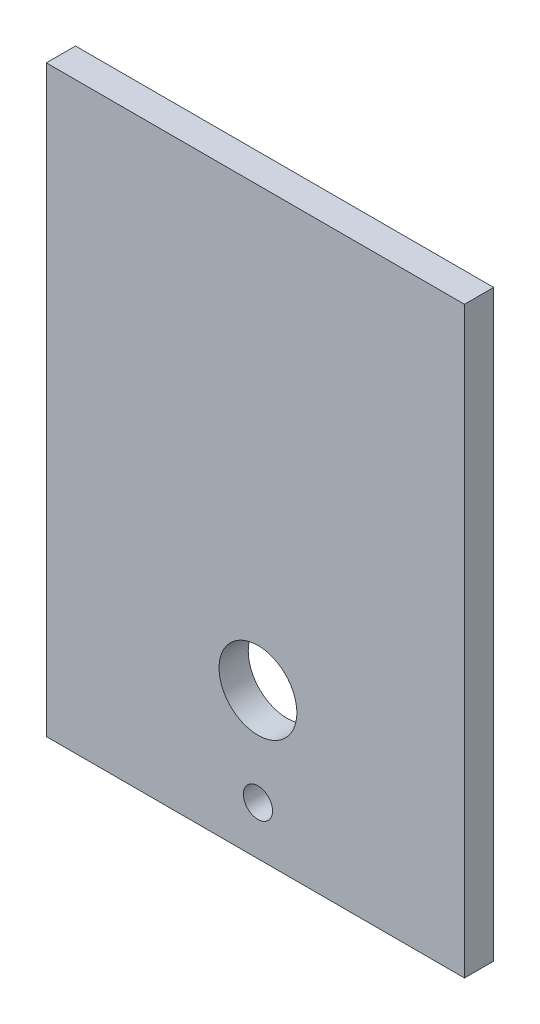
ISO-10303-21;
HEADER;
FILE_DESCRIPTION(('STEP AP214'),'2;1');
FILE_NAME('part.step','',(''),(''),'','','');
FILE_SCHEMA(('AUTOMOTIVE_DESIGN { 1 0 10303 214 1 1 1 1 }'));
ENDSEC;
DATA;
#1=APPLICATION_CONTEXT('core data for automotive mechanical design processes');
#2=APPLICATION_PROTOCOL_DEFINITION('international standard','automotive_design',2000,#1);
#3=PRODUCT_CONTEXT('',#1,'mechanical');
#4=PRODUCT('Part','Part','',(#3));
#5=PRODUCT_RELATED_PRODUCT_CATEGORY('part','',(#4));
#6=PRODUCT_DEFINITION_FORMATION('','',#4);
#7=PRODUCT_DEFINITION_CONTEXT('part definition',#1,'design');
#8=PRODUCT_DEFINITION('design','',#6,#7);
#9=PRODUCT_DEFINITION_SHAPE('','',#8);
#10=(LENGTH_UNIT() NAMED_UNIT(*) SI_UNIT(.MILLI.,.METRE.));
#11=(NAMED_UNIT(*) PLANE_ANGLE_UNIT() SI_UNIT($,.RADIAN.));
#12=(NAMED_UNIT(*) SI_UNIT($,.STERADIAN.) SOLID_ANGLE_UNIT());
#13=UNCERTAINTY_MEASURE_WITH_UNIT(LENGTH_MEASURE(1.E-05),#10,'distance_accuracy_value','');
#14=(GEOMETRIC_REPRESENTATION_CONTEXT(3) GLOBAL_UNCERTAINTY_ASSIGNED_CONTEXT((#13)) GLOBAL_UNIT_ASSIGNED_CONTEXT((#10,
#11,#12)) REPRESENTATION_CONTEXT('',''));
#15=CARTESIAN_POINT('',(0.,0.,0.));
#16=DIRECTION('',(0.,0.,1.));
#17=DIRECTION('',(1.,0.,0.));
#18=AXIS2_PLACEMENT_3D('',#15,#16,#17);
#19=CARTESIAN_POINT('',(0.,0.,76.2));
#20=DIRECTION('',(0.,0.,-1.));
#21=DIRECTION('',(-1.,0.,0.));
#22=AXIS2_PLACEMENT_3D('',#19,#20,#21);
#23=PLANE('',#22);
#24=DIRECTION('',(0.,-1.,0.));
#25=VECTOR('',#24,1.);
#26=CARTESIAN_POINT('',(0.,0.,76.2));
#27=LINE('',#26,#25);
#28=CARTESIAN_POINT('',(0.,1524.,76.2));
#29=VERTEX_POINT('',#28);
#30=CARTESIAN_POINT('',(0.,0.,76.2));
#31=VERTEX_POINT('',#30);
#32=EDGE_CURVE('E88',#29,#31,#27,.T.);
#33=ORIENTED_EDGE('',*,*,#32,.T.);
#34=DIRECTION('',(1.,0.,0.));
#35=VECTOR('',#34,1.);
#36=CARTESIAN_POINT('',(0.,0.,76.2));
#37=LINE('',#36,#35);
#38=CARTESIAN_POINT('',(1092.2,0.,76.2));
#39=VERTEX_POINT('',#38);
#40=EDGE_CURVE('E83',#31,#39,#37,.T.);
#41=ORIENTED_EDGE('',*,*,#40,.T.);
#42=DIRECTION('',(0.,1.,0.));
#43=VECTOR('',#42,1.);
#44=CARTESIAN_POINT('',(1092.2,0.,76.2));
#45=LINE('',#44,#43);
#46=CARTESIAN_POINT('',(1092.2,1524.,76.2));
#47=VERTEX_POINT('',#46);
#48=EDGE_CURVE('E86',#39,#47,#45,.T.);
#49=ORIENTED_EDGE('',*,*,#48,.T.);
#50=DIRECTION('',(-1.,0.,0.));
#51=VECTOR('',#50,1.);
#52=CARTESIAN_POINT('',(0.,1524.,76.2));
#53=LINE('',#52,#51);
#54=EDGE_CURVE('E53',#47,#29,#53,.T.);
#55=ORIENTED_EDGE('',*,*,#54,.T.);
#56=EDGE_LOOP('',(#33,#41,#49,#55));
#57=FACE_BOUND('',#56,.T.);
#58=CARTESIAN_POINT('',(552.718036359124,381.,76.2));
#59=DIRECTION('',(0.,0.,1.));
#60=DIRECTION('',(1.,0.,0.));
#61=AXIS2_PLACEMENT_3D('',#58,#59,#60);
#62=CIRCLE('',#61,101.6);
#63=CARTESIAN_POINT('',(451.118036359124,381.,76.2));
#64=VERTEX_POINT('',#63);
#65=EDGE_CURVE('E103',#64,#64,#62,.T.);
#66=ORIENTED_EDGE('',*,*,#65,.F.);
#67=EDGE_LOOP('',(#66));
#68=FACE_BOUND('',#67,.T.);
#69=CARTESIAN_POINT('',(552.718036359124,127.,76.2));
#70=DIRECTION('',(0.,0.,1.));
#71=DIRECTION('',(1.,0.,0.));
#72=AXIS2_PLACEMENT_3D('',#69,#70,#71);
#73=CIRCLE('',#72,38.1);
#74=CARTESIAN_POINT('',(514.618036359124,127.,76.2));
#75=VERTEX_POINT('',#74);
#76=EDGE_CURVE('E118',#75,#75,#73,.T.);
#77=ORIENTED_EDGE('',*,*,#76,.F.);
#78=EDGE_LOOP('',(#77));
#79=FACE_BOUND('',#78,.T.);
#80=ADVANCED_FACE('F36',(#57,#68,#79),#23,.F.);
#81=CARTESIAN_POINT('',(0.,0.,0.));
#82=DIRECTION('',(0.,0.,-1.));
#83=DIRECTION('',(-1.,0.,0.));
#84=AXIS2_PLACEMENT_3D('',#81,#82,#83);
#85=PLANE('',#84);
#86=CARTESIAN_POINT('',(552.718036359124,381.,0.));
#87=DIRECTION('',(0.,0.,1.));
#88=DIRECTION('',(1.,0.,0.));
#89=AXIS2_PLACEMENT_3D('',#86,#87,#88);
#90=CIRCLE('',#89,101.6);
#91=CARTESIAN_POINT('',(451.118036359124,381.,0.));
#92=VERTEX_POINT('',#91);
#93=EDGE_CURVE('E115',#92,#92,#90,.T.);
#94=ORIENTED_EDGE('',*,*,#93,.T.);
#95=EDGE_LOOP('',(#94));
#96=FACE_BOUND('',#95,.T.);
#97=DIRECTION('',(0.,-1.,0.));
#98=VECTOR('',#97,1.);
#99=CARTESIAN_POINT('',(0.,0.,0.));
#100=LINE('',#99,#98);
#101=CARTESIAN_POINT('',(0.,1524.,0.));
#102=VERTEX_POINT('',#101);
#103=CARTESIAN_POINT('',(0.,0.,0.));
#104=VERTEX_POINT('',#103);
#105=EDGE_CURVE('E100',#102,#104,#100,.T.);
#106=ORIENTED_EDGE('',*,*,#105,.F.);
#107=DIRECTION('',(-1.,0.,0.));
#108=VECTOR('',#107,1.);
#109=CARTESIAN_POINT('',(0.,1524.,0.));
#110=LINE('',#109,#108);
#111=CARTESIAN_POINT('',(1092.2,1524.,0.));
#112=VERTEX_POINT('',#111);
#113=EDGE_CURVE('E76',#112,#102,#110,.T.);
#114=ORIENTED_EDGE('',*,*,#113,.F.);
#115=DIRECTION('',(0.,1.,0.));
#116=VECTOR('',#115,1.);
#117=CARTESIAN_POINT('',(1092.2,0.,0.));
#118=LINE('',#117,#116);
#119=CARTESIAN_POINT('',(1092.2,0.,0.));
#120=VERTEX_POINT('',#119);
#121=EDGE_CURVE('E70',#120,#112,#118,.T.);
#122=ORIENTED_EDGE('',*,*,#121,.F.);
#123=DIRECTION('',(1.,0.,0.));
#124=VECTOR('',#123,1.);
#125=CARTESIAN_POINT('',(0.,0.,0.));
#126=LINE('',#125,#124);
#127=EDGE_CURVE('E92',#104,#120,#126,.T.);
#128=ORIENTED_EDGE('',*,*,#127,.F.);
#129=EDGE_LOOP('',(#106,#114,#122,#128));
#130=FACE_BOUND('',#129,.T.);
#131=CARTESIAN_POINT('',(552.718036359124,127.,0.));
#132=DIRECTION('',(0.,0.,1.));
#133=DIRECTION('',(1.,0.,0.));
#134=AXIS2_PLACEMENT_3D('',#131,#132,#133);
#135=CIRCLE('',#134,38.1);
#136=CARTESIAN_POINT('',(514.618036359124,127.,0.));
#137=VERTEX_POINT('',#136);
#138=EDGE_CURVE('E121',#137,#137,#135,.T.);
#139=ORIENTED_EDGE('',*,*,#138,.T.);
#140=EDGE_LOOP('',(#139));
#141=FACE_BOUND('',#140,.T.);
#142=ADVANCED_FACE('F111',(#96,#130,#141),#85,.T.);
#143=CARTESIAN_POINT('',(0.,0.,76.2));
#144=DIRECTION('',(1.,0.,0.));
#145=DIRECTION('',(0.,0.,-1.));
#146=AXIS2_PLACEMENT_3D('',#143,#144,#145);
#147=PLANE('',#146);
#148=ORIENTED_EDGE('',*,*,#105,.T.);
#149=DIRECTION('',(0.,0.,-1.));
#150=VECTOR('',#149,1.);
#151=CARTESIAN_POINT('',(0.,0.,76.2));
#152=LINE('',#151,#150);
#153=EDGE_CURVE('E11',#31,#104,#152,.T.);
#154=ORIENTED_EDGE('',*,*,#153,.F.);
#155=ORIENTED_EDGE('',*,*,#32,.F.);
#156=DIRECTION('',(0.,0.,-1.));
#157=VECTOR('',#156,1.);
#158=CARTESIAN_POINT('',(0.,1524.,76.2));
#159=LINE('',#158,#157);
#160=EDGE_CURVE('E96',#29,#102,#159,.T.);
#161=ORIENTED_EDGE('',*,*,#160,.T.);
#162=EDGE_LOOP('',(#148,#154,#155,#161));
#163=FACE_BOUND('',#162,.T.);
#164=ADVANCED_FACE('F38',(#163),#147,.F.);
#165=CARTESIAN_POINT('',(0.,0.,76.2));
#166=DIRECTION('',(0.,1.,0.));
#167=DIRECTION('',(0.,0.,1.));
#168=AXIS2_PLACEMENT_3D('',#165,#166,#167);
#169=PLANE('',#168);
#170=ORIENTED_EDGE('',*,*,#127,.T.);
#171=DIRECTION('',(0.,0.,-1.));
#172=VECTOR('',#171,1.);
#173=CARTESIAN_POINT('',(1092.2,0.,76.2));
#174=LINE('',#173,#172);
#175=EDGE_CURVE('E45',#39,#120,#174,.T.);
#176=ORIENTED_EDGE('',*,*,#175,.F.);
#177=ORIENTED_EDGE('',*,*,#40,.F.);
#178=ORIENTED_EDGE('',*,*,#153,.T.);
#179=EDGE_LOOP('',(#170,#176,#177,#178));
#180=FACE_BOUND('',#179,.T.);
#181=ADVANCED_FACE('F91',(#180),#169,.F.);
#182=CARTESIAN_POINT('',(1092.2,0.,76.2));
#183=DIRECTION('',(-1.,0.,0.));
#184=DIRECTION('',(0.,0.,1.));
#185=AXIS2_PLACEMENT_3D('',#182,#183,#184);
#186=PLANE('',#185);
#187=ORIENTED_EDGE('',*,*,#121,.T.);
#188=DIRECTION('',(0.,0.,-1.));
#189=VECTOR('',#188,1.);
#190=CARTESIAN_POINT('',(1092.2,1524.,76.2));
#191=LINE('',#190,#189);
#192=EDGE_CURVE('E93',#47,#112,#191,.T.);
#193=ORIENTED_EDGE('',*,*,#192,.F.);
#194=ORIENTED_EDGE('',*,*,#48,.F.);
#195=ORIENTED_EDGE('',*,*,#175,.T.);
#196=EDGE_LOOP('',(#187,#193,#194,#195));
#197=FACE_BOUND('',#196,.T.);
#198=ADVANCED_FACE('F94',(#197),#186,.F.);
#199=CARTESIAN_POINT('',(0.,1524.,76.2));
#200=DIRECTION('',(0.,-1.,0.));
#201=DIRECTION('',(0.,0.,-1.));
#202=AXIS2_PLACEMENT_3D('',#199,#200,#201);
#203=PLANE('',#202);
#204=ORIENTED_EDGE('',*,*,#113,.T.);
#205=ORIENTED_EDGE('',*,*,#160,.F.);
#206=ORIENTED_EDGE('',*,*,#54,.F.);
#207=ORIENTED_EDGE('',*,*,#192,.T.);
#208=EDGE_LOOP('',(#204,#205,#206,#207));
#209=FACE_BOUND('',#208,.T.);
#210=ADVANCED_FACE('F108',(#209),#203,.F.);
#211=CARTESIAN_POINT('',(552.718036359124,381.,76.2));
#212=DIRECTION('',(0.,0.,-1.));
#213=DIRECTION('',(-1.,0.,0.));
#214=AXIS2_PLACEMENT_3D('',#211,#212,#213);
#215=CYLINDRICAL_SURFACE('',#214,101.6);
#216=CARTESIAN_POINT('',(451.118036359124,381.,76.2));
#217=CARTESIAN_POINT('',(451.118036359124,381.,75.40625));
#218=CARTESIAN_POINT('',(451.118036359124,381.,74.6125));
#219=CARTESIAN_POINT('',(451.118036359124,381.,73.025));
#220=CARTESIAN_POINT('',(451.118036359124,381.,72.23125));
#221=CARTESIAN_POINT('',(451.118036359124,381.,70.64375));
#222=CARTESIAN_POINT('',(451.118036359124,381.,69.85));
#223=CARTESIAN_POINT('',(451.118036359124,381.,68.2625));
#224=CARTESIAN_POINT('',(451.118036359124,381.,67.46875));
#225=CARTESIAN_POINT('',(451.118036359124,381.,65.88125));
#226=CARTESIAN_POINT('',(451.118036359124,381.,65.0875));
#227=CARTESIAN_POINT('',(451.118036359124,381.,63.5));
#228=CARTESIAN_POINT('',(451.118036359124,381.,62.70625));
#229=CARTESIAN_POINT('',(451.118036359124,381.,61.11875));
#230=CARTESIAN_POINT('',(451.118036359124,381.,60.325));
#231=CARTESIAN_POINT('',(451.118036359124,381.,58.7375));
#232=CARTESIAN_POINT('',(451.118036359124,381.,57.94375));
#233=CARTESIAN_POINT('',(451.118036359124,381.,56.35625));
#234=CARTESIAN_POINT('',(451.118036359124,381.,55.5625));
#235=CARTESIAN_POINT('',(451.118036359124,381.,53.975));
#236=CARTESIAN_POINT('',(451.118036359124,381.,53.18125));
#237=CARTESIAN_POINT('',(451.118036359124,381.,51.59375));
#238=CARTESIAN_POINT('',(451.118036359124,381.,50.8));
#239=CARTESIAN_POINT('',(451.118036359124,381.,49.2125));
#240=CARTESIAN_POINT('',(451.118036359124,381.,48.41875));
#241=CARTESIAN_POINT('',(451.118036359124,381.,46.83125));
#242=CARTESIAN_POINT('',(451.118036359124,381.,46.0375));
#243=CARTESIAN_POINT('',(451.118036359124,381.,44.45));
#244=CARTESIAN_POINT('',(451.118036359124,381.,43.65625));
#245=CARTESIAN_POINT('',(451.118036359124,381.,42.06875));
#246=CARTESIAN_POINT('',(451.118036359124,381.,41.275));
#247=CARTESIAN_POINT('',(451.118036359124,381.,39.6875));
#248=CARTESIAN_POINT('',(451.118036359124,381.,38.89375));
#249=CARTESIAN_POINT('',(451.118036359124,381.,37.30625));
#250=CARTESIAN_POINT('',(451.118036359124,381.,36.5125));
#251=CARTESIAN_POINT('',(451.118036359124,381.,34.925));
#252=CARTESIAN_POINT('',(451.118036359124,381.,34.13125));
#253=CARTESIAN_POINT('',(451.118036359124,381.,32.54375));
#254=CARTESIAN_POINT('',(451.118036359124,381.,31.75));
#255=CARTESIAN_POINT('',(451.118036359124,381.,30.1625));
#256=CARTESIAN_POINT('',(451.118036359124,381.,29.36875));
#257=CARTESIAN_POINT('',(451.118036359124,381.,27.78125));
#258=CARTESIAN_POINT('',(451.118036359124,381.,26.9875));
#259=CARTESIAN_POINT('',(451.118036359124,381.,25.4));
#260=CARTESIAN_POINT('',(451.118036359124,381.,24.60625));
#261=CARTESIAN_POINT('',(451.118036359124,381.,23.01875));
#262=CARTESIAN_POINT('',(451.118036359124,381.,22.225));
#263=CARTESIAN_POINT('',(451.118036359124,381.,20.6375));
#264=CARTESIAN_POINT('',(451.118036359124,381.,19.84375));
#265=CARTESIAN_POINT('',(451.118036359124,381.,18.25625));
#266=CARTESIAN_POINT('',(451.118036359124,381.,17.4625));
#267=CARTESIAN_POINT('',(451.118036359124,381.,15.875));
#268=CARTESIAN_POINT('',(451.118036359124,381.,15.08125));
#269=CARTESIAN_POINT('',(451.118036359124,381.,13.49375));
#270=CARTESIAN_POINT('',(451.118036359124,381.,12.7));
#271=CARTESIAN_POINT('',(451.118036359124,381.,11.1125));
#272=CARTESIAN_POINT('',(451.118036359124,381.,10.31875));
#273=CARTESIAN_POINT('',(451.118036359124,381.,8.73125));
#274=CARTESIAN_POINT('',(451.118036359124,381.,7.93750000000001));
#275=CARTESIAN_POINT('',(451.118036359124,381.,6.35));
#276=CARTESIAN_POINT('',(451.118036359124,381.,5.55625));
#277=CARTESIAN_POINT('',(451.118036359124,381.,3.96875));
#278=CARTESIAN_POINT('',(451.118036359124,381.,3.175));
#279=CARTESIAN_POINT('',(451.118036359124,381.,1.5875));
#280=CARTESIAN_POINT('',(451.118036359124,381.,0.793750000000001));
#281=CARTESIAN_POINT('',(451.118036359124,381.,0.));
#282=B_SPLINE_CURVE_WITH_KNOTS('',3,(#216,#217,#218,#219,#220,#221,#222,#223,#224,#225,#226,
#227,#228,#229,#230,#231,#232,#233,#234,#235,#236,#237,#238,#239,#240,#241,#242,#243,#244,#245,
#246,#247,#248,#249,#250,#251,#252,#253,#254,#255,#256,#257,#258,#259,#260,#261,#262,#263,#264,
#265,#266,#267,#268,#269,#270,#271,#272,#273,#274,#275,#276,#277,#278,#279,#280,#281),
.UNSPECIFIED.,.F.,.F.,(4,2,2,2,2,2,2,2,2,2,2,2,2,2,2,2,2,2,2,2,2,2,2,2,2,2,2,2,2,2,2,2,4),(0.,
2.38125,4.7625,7.14375,9.52500000000001,11.90625,14.2875,16.66875,19.05,21.43125,23.8125,
26.19375,28.575,30.95625,33.3375,35.71875,38.1,40.48125,42.8625,45.24375,47.625,50.00625,
52.3875,54.76875,57.15,59.53125,61.9125,64.29375,66.675,69.05625,71.4375,73.81875,76.2),.UNSPECIFIED.);
#283=EDGE_CURVE('BSEAM138',#64,#92,#282,.T.);
#284=ORIENTED_EDGE('',*,*,#65,.T.);
#285=ORIENTED_EDGE('',*,*,#93,.F.);
#286=ORIENTED_EDGE('',*,*,#283,.T.);
#287=ORIENTED_EDGE('',*,*,#283,.F.);
#288=EDGE_LOOP('',(#284,#286,#285,#287));
#289=FACE_BOUND('',#288,.T.);
#290=ADVANCED_FACE('F138',(#289),#215,.F.);
#291=CARTESIAN_POINT('',(552.718036359124,127.,76.2));
#292=DIRECTION('',(0.,0.,-1.));
#293=DIRECTION('',(-1.,0.,0.));
#294=AXIS2_PLACEMENT_3D('',#291,#292,#293);
#295=CYLINDRICAL_SURFACE('',#294,38.1);
#296=CARTESIAN_POINT('',(514.618036359124,127.,76.2));
#297=CARTESIAN_POINT('',(514.618036359124,127.,75.40625));
#298=CARTESIAN_POINT('',(514.618036359124,127.,74.6125));
#299=CARTESIAN_POINT('',(514.618036359124,127.,73.025));
#300=CARTESIAN_POINT('',(514.618036359124,127.,72.23125));
#301=CARTESIAN_POINT('',(514.618036359124,127.,70.64375));
#302=CARTESIAN_POINT('',(514.618036359124,127.,69.85));
#303=CARTESIAN_POINT('',(514.618036359124,127.,68.2625));
#304=CARTESIAN_POINT('',(514.618036359124,127.,67.46875));
#305=CARTESIAN_POINT('',(514.618036359124,127.,65.88125));
#306=CARTESIAN_POINT('',(514.618036359124,127.,65.0875));
#307=CARTESIAN_POINT('',(514.618036359124,127.,63.5));
#308=CARTESIAN_POINT('',(514.618036359124,127.,62.70625));
#309=CARTESIAN_POINT('',(514.618036359124,127.,61.11875));
#310=CARTESIAN_POINT('',(514.618036359124,127.,60.325));
#311=CARTESIAN_POINT('',(514.618036359124,127.,58.7375));
#312=CARTESIAN_POINT('',(514.618036359124,127.,57.94375));
#313=CARTESIAN_POINT('',(514.618036359124,127.,56.35625));
#314=CARTESIAN_POINT('',(514.618036359124,127.,55.5625));
#315=CARTESIAN_POINT('',(514.618036359124,127.,53.975));
#316=CARTESIAN_POINT('',(514.618036359124,127.,53.18125));
#317=CARTESIAN_POINT('',(514.618036359124,127.,51.59375));
#318=CARTESIAN_POINT('',(514.618036359124,127.,50.8));
#319=CARTESIAN_POINT('',(514.618036359124,127.,49.2125));
#320=CARTESIAN_POINT('',(514.618036359124,127.,48.41875));
#321=CARTESIAN_POINT('',(514.618036359124,127.,46.83125));
#322=CARTESIAN_POINT('',(514.618036359124,127.,46.0375));
#323=CARTESIAN_POINT('',(514.618036359124,127.,44.45));
#324=CARTESIAN_POINT('',(514.618036359124,127.,43.65625));
#325=CARTESIAN_POINT('',(514.618036359124,127.,42.06875));
#326=CARTESIAN_POINT('',(514.618036359124,127.,41.275));
#327=CARTESIAN_POINT('',(514.618036359124,127.,39.6875));
#328=CARTESIAN_POINT('',(514.618036359124,127.,38.89375));
#329=CARTESIAN_POINT('',(514.618036359124,127.,37.30625));
#330=CARTESIAN_POINT('',(514.618036359124,127.,36.5125));
#331=CARTESIAN_POINT('',(514.618036359124,127.,34.925));
#332=CARTESIAN_POINT('',(514.618036359124,127.,34.13125));
#333=CARTESIAN_POINT('',(514.618036359124,127.,32.54375));
#334=CARTESIAN_POINT('',(514.618036359124,127.,31.75));
#335=CARTESIAN_POINT('',(514.618036359124,127.,30.1625));
#336=CARTESIAN_POINT('',(514.618036359124,127.,29.36875));
#337=CARTESIAN_POINT('',(514.618036359124,127.,27.78125));
#338=CARTESIAN_POINT('',(514.618036359124,127.,26.9875));
#339=CARTESIAN_POINT('',(514.618036359124,127.,25.4));
#340=CARTESIAN_POINT('',(514.618036359124,127.,24.60625));
#341=CARTESIAN_POINT('',(514.618036359124,127.,23.01875));
#342=CARTESIAN_POINT('',(514.618036359124,127.,22.225));
#343=CARTESIAN_POINT('',(514.618036359124,127.,20.6375));
#344=CARTESIAN_POINT('',(514.618036359124,127.,19.84375));
#345=CARTESIAN_POINT('',(514.618036359124,127.,18.25625));
#346=CARTESIAN_POINT('',(514.618036359124,127.,17.4625));
#347=CARTESIAN_POINT('',(514.618036359124,127.,15.875));
#348=CARTESIAN_POINT('',(514.618036359124,127.,15.08125));
#349=CARTESIAN_POINT('',(514.618036359124,127.,13.49375));
#350=CARTESIAN_POINT('',(514.618036359124,127.,12.7));
#351=CARTESIAN_POINT('',(514.618036359124,127.,11.1125));
#352=CARTESIAN_POINT('',(514.618036359124,127.,10.31875));
#353=CARTESIAN_POINT('',(514.618036359124,127.,8.73125));
#354=CARTESIAN_POINT('',(514.618036359124,127.,7.93750000000001));
#355=CARTESIAN_POINT('',(514.618036359124,127.,6.35));
#356=CARTESIAN_POINT('',(514.618036359124,127.,5.55625));
#357=CARTESIAN_POINT('',(514.618036359124,127.,3.96875));
#358=CARTESIAN_POINT('',(514.618036359124,127.,3.175));
#359=CARTESIAN_POINT('',(514.618036359124,127.,1.5875));
#360=CARTESIAN_POINT('',(514.618036359124,127.,0.793750000000001));
#361=CARTESIAN_POINT('',(514.618036359124,127.,0.));
#362=B_SPLINE_CURVE_WITH_KNOTS('',3,(#296,#297,#298,#299,#300,#301,#302,#303,#304,#305,#306,
#307,#308,#309,#310,#311,#312,#313,#314,#315,#316,#317,#318,#319,#320,#321,#322,#323,#324,#325,
#326,#327,#328,#329,#330,#331,#332,#333,#334,#335,#336,#337,#338,#339,#340,#341,#342,#343,#344,
#345,#346,#347,#348,#349,#350,#351,#352,#353,#354,#355,#356,#357,#358,#359,#360,#361),
.UNSPECIFIED.,.F.,.F.,(4,2,2,2,2,2,2,2,2,2,2,2,2,2,2,2,2,2,2,2,2,2,2,2,2,2,2,2,2,2,2,2,4),(0.,
2.38125,4.7625,7.14375,9.52500000000001,11.90625,14.2875,16.66875,19.05,21.43125,23.8125,
26.19375,28.575,30.95625,33.3375,35.71875,38.1,40.48125,42.8625,45.24375,47.625,50.00625,
52.3875,54.76875,57.15,59.53125,61.9125,64.29375,66.675,69.05625,71.4375,73.81875,76.2),.UNSPECIFIED.);
#363=EDGE_CURVE('BSEAM127',#75,#137,#362,.T.);
#364=ORIENTED_EDGE('',*,*,#76,.T.);
#365=ORIENTED_EDGE('',*,*,#138,.F.);
#366=ORIENTED_EDGE('',*,*,#363,.T.);
#367=ORIENTED_EDGE('',*,*,#363,.F.);
#368=EDGE_LOOP('',(#364,#366,#365,#367));
#369=FACE_BOUND('',#368,.T.);
#370=ADVANCED_FACE('F127',(#369),#295,.F.);
#371=CLOSED_SHELL('',(#80,#142,#164,#181,#198,#210,#290,#370));
#372=MANIFOLD_SOLID_BREP('B2',#371);
#373=ADVANCED_BREP_SHAPE_REPRESENTATION('',(#18,#372),#14);
#374=SHAPE_DEFINITION_REPRESENTATION(#9,#373);
ENDSEC;
END-ISO-10303-21;
